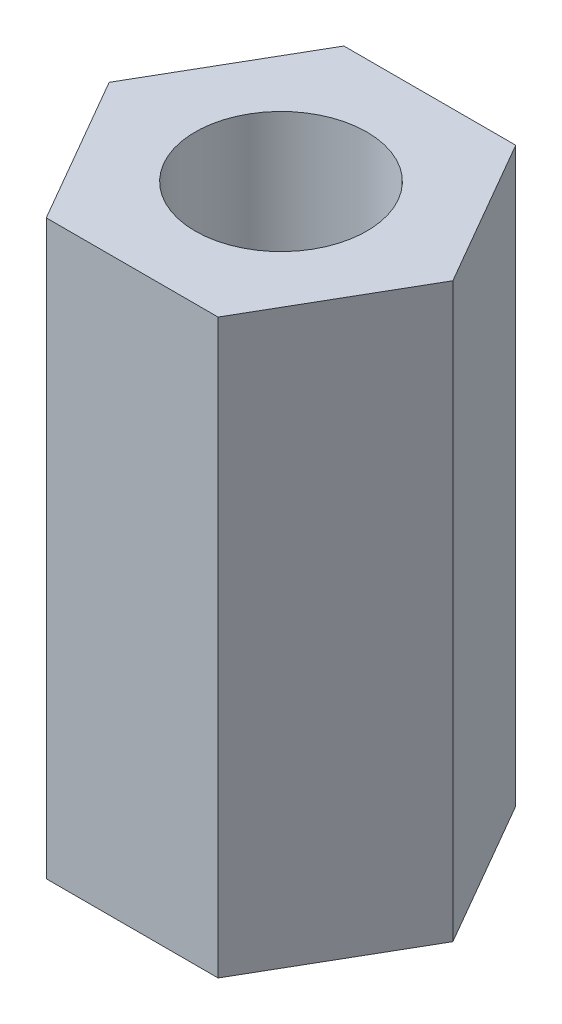
ISO-10303-21;
HEADER;
FILE_DESCRIPTION(('STEP AP214'),'2;1');
FILE_NAME('part.step','',(''),(''),'','','');
FILE_SCHEMA(('AUTOMOTIVE_DESIGN { 1 0 10303 214 1 1 1 1 }'));
ENDSEC;
DATA;
#1=APPLICATION_CONTEXT('core data for automotive mechanical design processes');
#2=APPLICATION_PROTOCOL_DEFINITION('international standard','automotive_design',2000,#1);
#3=PRODUCT_CONTEXT('',#1,'mechanical');
#4=PRODUCT('Part','Part','',(#3));
#5=PRODUCT_RELATED_PRODUCT_CATEGORY('part','',(#4));
#6=PRODUCT_DEFINITION_FORMATION('','',#4);
#7=PRODUCT_DEFINITION_CONTEXT('part definition',#1,'design');
#8=PRODUCT_DEFINITION('design','',#6,#7);
#9=PRODUCT_DEFINITION_SHAPE('','',#8);
#10=(LENGTH_UNIT() NAMED_UNIT(*) SI_UNIT(.MILLI.,.METRE.));
#11=(NAMED_UNIT(*) PLANE_ANGLE_UNIT() SI_UNIT($,.RADIAN.));
#12=(NAMED_UNIT(*) SI_UNIT($,.STERADIAN.) SOLID_ANGLE_UNIT());
#13=UNCERTAINTY_MEASURE_WITH_UNIT(LENGTH_MEASURE(1.E-05),#10,'distance_accuracy_value','');
#14=(GEOMETRIC_REPRESENTATION_CONTEXT(3) GLOBAL_UNCERTAINTY_ASSIGNED_CONTEXT((#13)) GLOBAL_UNIT_ASSIGNED_CONTEXT((#10,
#11,#12)) REPRESENTATION_CONTEXT('',''));
#15=CARTESIAN_POINT('',(0.,0.,0.));
#16=DIRECTION('',(0.,0.,1.));
#17=DIRECTION('',(1.,0.,0.));
#18=AXIS2_PLACEMENT_3D('',#15,#16,#17);
#19=CARTESIAN_POINT('',(0.,10.,0.));
#20=DIRECTION('',(0.,1.,0.));
#21=DIRECTION('',(0.,0.,1.));
#22=AXIS2_PLACEMENT_3D('',#19,#20,#21);
#23=PLANE('',#22);
#24=DIRECTION('',(-0.5,0.,-0.866025403784439));
#25=VECTOR('',#24,1.);
#26=CARTESIAN_POINT('',(3.00222139978605,10.,0.));
#27=LINE('',#26,#25);
#28=CARTESIAN_POINT('',(3.00222139978605,10.,0.));
#29=VERTEX_POINT('',#28);
#30=CARTESIAN_POINT('',(1.50111069989303,10.,-2.6));
#31=VERTEX_POINT('',#30);
#32=EDGE_CURVE('E129',#29,#31,#27,.T.);
#33=ORIENTED_EDGE('',*,*,#32,.T.);
#34=DIRECTION('',(-1.,0.,0.));
#35=VECTOR('',#34,1.);
#36=CARTESIAN_POINT('',(1.50111069989303,10.,-2.6));
#37=LINE('',#36,#35);
#38=CARTESIAN_POINT('',(-1.50111069989303,10.,-2.6));
#39=VERTEX_POINT('',#38);
#40=EDGE_CURVE('E87',#31,#39,#37,.T.);
#41=ORIENTED_EDGE('',*,*,#40,.T.);
#42=DIRECTION('',(-0.5,0.,0.866025403784439));
#43=VECTOR('',#42,1.);
#44=CARTESIAN_POINT('',(-1.50111069989303,10.,-2.6));
#45=LINE('',#44,#43);
#46=CARTESIAN_POINT('',(-3.00222139978605,10.,0.));
#47=VERTEX_POINT('',#46);
#48=EDGE_CURVE('E100',#39,#47,#45,.T.);
#49=ORIENTED_EDGE('',*,*,#48,.T.);
#50=DIRECTION('',(0.5,0.,0.866025403784439));
#51=VECTOR('',#50,1.);
#52=CARTESIAN_POINT('',(-3.00222139978605,10.,0.));
#53=LINE('',#52,#51);
#54=CARTESIAN_POINT('',(-1.50111069989303,10.,2.6));
#55=VERTEX_POINT('',#54);
#56=EDGE_CURVE('E94',#47,#55,#53,.T.);
#57=ORIENTED_EDGE('',*,*,#56,.T.);
#58=DIRECTION('',(1.,0.,0.));
#59=VECTOR('',#58,1.);
#60=CARTESIAN_POINT('',(-1.50111069989303,10.,2.6));
#61=LINE('',#60,#59);
#62=CARTESIAN_POINT('',(1.50111069989303,10.,2.6));
#63=VERTEX_POINT('',#62);
#64=EDGE_CURVE('E98',#55,#63,#61,.T.);
#65=ORIENTED_EDGE('',*,*,#64,.T.);
#66=DIRECTION('',(0.5,0.,-0.866025403784438));
#67=VECTOR('',#66,1.);
#68=CARTESIAN_POINT('',(1.50111069989303,10.,2.6));
#69=LINE('',#68,#67);
#70=EDGE_CURVE('E50',#63,#29,#69,.T.);
#71=ORIENTED_EDGE('',*,*,#70,.T.);
#72=EDGE_LOOP('',(#33,#41,#49,#57,#65,#71));
#73=FACE_BOUND('',#72,.T.);
#74=CARTESIAN_POINT('',(0.,10.,0.));
#75=DIRECTION('',(0.,1.,0.));
#76=DIRECTION('',(0.,0.,1.));
#77=AXIS2_PLACEMENT_3D('',#74,#75,#76);
#78=CIRCLE('',#77,1.5);
#79=CARTESIAN_POINT('',(0.,10.,1.5));
#80=VERTEX_POINT('',#79);
#81=EDGE_CURVE('E122',#80,#80,#78,.T.);
#82=ORIENTED_EDGE('',*,*,#81,.F.);
#83=EDGE_LOOP('',(#82));
#84=FACE_BOUND('',#83,.T.);
#85=ADVANCED_FACE('F33',(#73,#84),#23,.T.);
#86=CARTESIAN_POINT('',(0.,0.,0.));
#87=DIRECTION('',(0.,1.,0.));
#88=DIRECTION('',(0.,0.,1.));
#89=AXIS2_PLACEMENT_3D('',#86,#87,#88);
#90=PLANE('',#89);
#91=DIRECTION('',(-0.5,0.,-0.866025403784439));
#92=VECTOR('',#91,1.);
#93=CARTESIAN_POINT('',(3.00222139978605,0.,0.));
#94=LINE('',#93,#92);
#95=CARTESIAN_POINT('',(3.00222139978605,0.,0.));
#96=VERTEX_POINT('',#95);
#97=CARTESIAN_POINT('',(1.50111069989303,0.,-2.6));
#98=VERTEX_POINT('',#97);
#99=EDGE_CURVE('E118',#96,#98,#94,.T.);
#100=ORIENTED_EDGE('',*,*,#99,.F.);
#101=DIRECTION('',(0.5,0.,-0.866025403784438));
#102=VECTOR('',#101,1.);
#103=CARTESIAN_POINT('',(1.50111069989303,0.,2.6));
#104=LINE('',#103,#102);
#105=CARTESIAN_POINT('',(1.50111069989303,0.,2.6));
#106=VERTEX_POINT('',#105);
#107=EDGE_CURVE('E79',#106,#96,#104,.T.);
#108=ORIENTED_EDGE('',*,*,#107,.F.);
#109=DIRECTION('',(1.,0.,0.));
#110=VECTOR('',#109,1.);
#111=CARTESIAN_POINT('',(-1.50111069989303,0.,2.6));
#112=LINE('',#111,#110);
#113=CARTESIAN_POINT('',(-1.50111069989303,0.,2.6));
#114=VERTEX_POINT('',#113);
#115=EDGE_CURVE('E73',#114,#106,#112,.T.);
#116=ORIENTED_EDGE('',*,*,#115,.F.);
#117=DIRECTION('',(0.5,0.,0.866025403784439));
#118=VECTOR('',#117,1.);
#119=CARTESIAN_POINT('',(-3.00222139978605,0.,0.));
#120=LINE('',#119,#118);
#121=CARTESIAN_POINT('',(-3.00222139978605,0.,0.));
#122=VERTEX_POINT('',#121);
#123=EDGE_CURVE('E108',#122,#114,#120,.T.);
#124=ORIENTED_EDGE('',*,*,#123,.F.);
#125=DIRECTION('',(-0.5,0.,0.866025403784439));
#126=VECTOR('',#125,1.);
#127=CARTESIAN_POINT('',(-1.50111069989303,0.,-2.6));
#128=LINE('',#127,#126);
#129=CARTESIAN_POINT('',(-1.50111069989303,0.,-2.6));
#130=VERTEX_POINT('',#129);
#131=EDGE_CURVE('E124',#130,#122,#128,.T.);
#132=ORIENTED_EDGE('',*,*,#131,.F.);
#133=DIRECTION('',(-1.,0.,0.));
#134=VECTOR('',#133,1.);
#135=CARTESIAN_POINT('',(1.50111069989303,0.,-2.6));
#136=LINE('',#135,#134);
#137=EDGE_CURVE('E121',#98,#130,#136,.T.);
#138=ORIENTED_EDGE('',*,*,#137,.F.);
#139=EDGE_LOOP('',(#100,#108,#116,#124,#132,#138));
#140=FACE_BOUND('',#139,.T.);
#141=CARTESIAN_POINT('',(0.,0.,0.));
#142=DIRECTION('',(0.,1.,0.));
#143=DIRECTION('',(0.,0.,1.));
#144=AXIS2_PLACEMENT_3D('',#141,#142,#143);
#145=CIRCLE('',#144,1.5);
#146=CARTESIAN_POINT('',(0.,0.,1.5));
#147=VERTEX_POINT('',#146);
#148=EDGE_CURVE('E222',#147,#147,#145,.T.);
#149=ORIENTED_EDGE('',*,*,#148,.T.);
#150=EDGE_LOOP('',(#149));
#151=FACE_BOUND('',#150,.T.);
#152=ADVANCED_FACE('F138',(#140,#151),#90,.F.);
#153=CARTESIAN_POINT('',(3.00222139978605,10.,0.));
#154=DIRECTION('',(-0.866025403784439,0.,0.5));
#155=DIRECTION('',(0.5,0.,0.866025403784439));
#156=AXIS2_PLACEMENT_3D('',#153,#154,#155);
#157=PLANE('',#156);
#158=ORIENTED_EDGE('',*,*,#99,.T.);
#159=DIRECTION('',(0.,-1.,0.));
#160=VECTOR('',#159,1.);
#161=CARTESIAN_POINT('',(1.50111069989303,10.,-2.6));
#162=LINE('',#161,#160);
#163=EDGE_CURVE('E11',#31,#98,#162,.T.);
#164=ORIENTED_EDGE('',*,*,#163,.F.);
#165=ORIENTED_EDGE('',*,*,#32,.F.);
#166=DIRECTION('',(0.,-1.,0.));
#167=VECTOR('',#166,1.);
#168=CARTESIAN_POINT('',(3.00222139978605,10.,0.));
#169=LINE('',#168,#167);
#170=EDGE_CURVE('E114',#29,#96,#169,.T.);
#171=ORIENTED_EDGE('',*,*,#170,.T.);
#172=EDGE_LOOP('',(#158,#164,#165,#171));
#173=FACE_BOUND('',#172,.T.);
#174=ADVANCED_FACE('F35',(#173),#157,.F.);
#175=CARTESIAN_POINT('',(1.50111069989303,10.,-2.6));
#176=DIRECTION('',(0.,0.,1.));
#177=DIRECTION('',(1.,0.,0.));
#178=AXIS2_PLACEMENT_3D('',#175,#176,#177);
#179=PLANE('',#178);
#180=ORIENTED_EDGE('',*,*,#137,.T.);
#181=DIRECTION('',(0.,-1.,0.));
#182=VECTOR('',#181,1.);
#183=CARTESIAN_POINT('',(-1.50111069989303,10.,-2.6));
#184=LINE('',#183,#182);
#185=EDGE_CURVE('E42',#39,#130,#184,.T.);
#186=ORIENTED_EDGE('',*,*,#185,.F.);
#187=ORIENTED_EDGE('',*,*,#40,.F.);
#188=ORIENTED_EDGE('',*,*,#163,.T.);
#189=EDGE_LOOP('',(#180,#186,#187,#188));
#190=FACE_BOUND('',#189,.T.);
#191=ADVANCED_FACE('F163',(#190),#179,.F.);
#192=CARTESIAN_POINT('',(-1.50111069989303,10.,-2.6));
#193=DIRECTION('',(0.866025403784438,0.,0.5));
#194=DIRECTION('',(0.5,0.,-0.866025403784439));
#195=AXIS2_PLACEMENT_3D('',#192,#193,#194);
#196=PLANE('',#195);
#197=ORIENTED_EDGE('',*,*,#131,.T.);
#198=DIRECTION('',(0.,-1.,0.));
#199=VECTOR('',#198,1.);
#200=CARTESIAN_POINT('',(-3.00222139978605,10.,0.));
#201=LINE('',#200,#199);
#202=EDGE_CURVE('E109',#47,#122,#201,.T.);
#203=ORIENTED_EDGE('',*,*,#202,.F.);
#204=ORIENTED_EDGE('',*,*,#48,.F.);
#205=ORIENTED_EDGE('',*,*,#185,.T.);
#206=EDGE_LOOP('',(#197,#203,#204,#205));
#207=FACE_BOUND('',#206,.T.);
#208=ADVANCED_FACE('F135',(#207),#196,.F.);
#209=CARTESIAN_POINT('',(-3.00222139978605,10.,0.));
#210=DIRECTION('',(0.866025403784439,0.,-0.5));
#211=DIRECTION('',(-0.5,0.,-0.866025403784439));
#212=AXIS2_PLACEMENT_3D('',#209,#210,#211);
#213=PLANE('',#212);
#214=ORIENTED_EDGE('',*,*,#123,.T.);
#215=DIRECTION('',(0.,-1.,0.));
#216=VECTOR('',#215,1.);
#217=CARTESIAN_POINT('',(-1.50111069989303,10.,2.6));
#218=LINE('',#217,#216);
#219=EDGE_CURVE('E105',#55,#114,#218,.T.);
#220=ORIENTED_EDGE('',*,*,#219,.F.);
#221=ORIENTED_EDGE('',*,*,#56,.F.);
#222=ORIENTED_EDGE('',*,*,#202,.T.);
#223=EDGE_LOOP('',(#214,#220,#221,#222));
#224=FACE_BOUND('',#223,.T.);
#225=ADVANCED_FACE('F106',(#224),#213,.F.);
#226=CARTESIAN_POINT('',(-1.50111069989303,10.,2.6));
#227=DIRECTION('',(0.,0.,-1.));
#228=DIRECTION('',(-1.,0.,0.));
#229=AXIS2_PLACEMENT_3D('',#226,#227,#228);
#230=PLANE('',#229);
#231=ORIENTED_EDGE('',*,*,#115,.T.);
#232=DIRECTION('',(0.,-1.,0.));
#233=VECTOR('',#232,1.);
#234=CARTESIAN_POINT('',(1.50111069989303,10.,2.6));
#235=LINE('',#234,#233);
#236=EDGE_CURVE('E110',#63,#106,#235,.T.);
#237=ORIENTED_EDGE('',*,*,#236,.F.);
#238=ORIENTED_EDGE('',*,*,#64,.F.);
#239=ORIENTED_EDGE('',*,*,#219,.T.);
#240=EDGE_LOOP('',(#231,#237,#238,#239));
#241=FACE_BOUND('',#240,.T.);
#242=ADVANCED_FACE('F112',(#241),#230,.F.);
#243=CARTESIAN_POINT('',(1.50111069989303,10.,2.6));
#244=DIRECTION('',(-0.866025403784438,0.,-0.5));
#245=DIRECTION('',(-0.5,0.,0.866025403784438));
#246=AXIS2_PLACEMENT_3D('',#243,#244,#245);
#247=PLANE('',#246);
#248=ORIENTED_EDGE('',*,*,#107,.T.);
#249=ORIENTED_EDGE('',*,*,#170,.F.);
#250=ORIENTED_EDGE('',*,*,#70,.F.);
#251=ORIENTED_EDGE('',*,*,#236,.T.);
#252=EDGE_LOOP('',(#248,#249,#250,#251));
#253=FACE_BOUND('',#252,.T.);
#254=ADVANCED_FACE('F143',(#253),#247,.F.);
#255=CARTESIAN_POINT('',(0.,10.,0.));
#256=DIRECTION('',(0.,-1.,0.));
#257=DIRECTION('',(0.,0.,-1.));
#258=AXIS2_PLACEMENT_3D('',#255,#256,#257);
#259=CYLINDRICAL_SURFACE('',#258,1.5);
#260=ORIENTED_EDGE('',*,*,#81,.T.);
#261=EDGE_LOOP('',(#260));
#262=FACE_BOUND('',#261,.T.);
#263=ORIENTED_EDGE('',*,*,#148,.F.);
#264=EDGE_LOOP('',(#263));
#265=FACE_BOUND('',#264,.T.);
#266=ADVANCED_FACE('F145',(#262,#265),#259,.F.);
#267=CLOSED_SHELL('',(#85,#152,#174,#191,#208,#225,#242,#254,#266));
#268=MANIFOLD_SOLID_BREP('B2',#267);
#269=ADVANCED_BREP_SHAPE_REPRESENTATION('',(#18,#268),#14);
#270=SHAPE_DEFINITION_REPRESENTATION(#9,#269);
ENDSEC;
END-ISO-10303-21;
